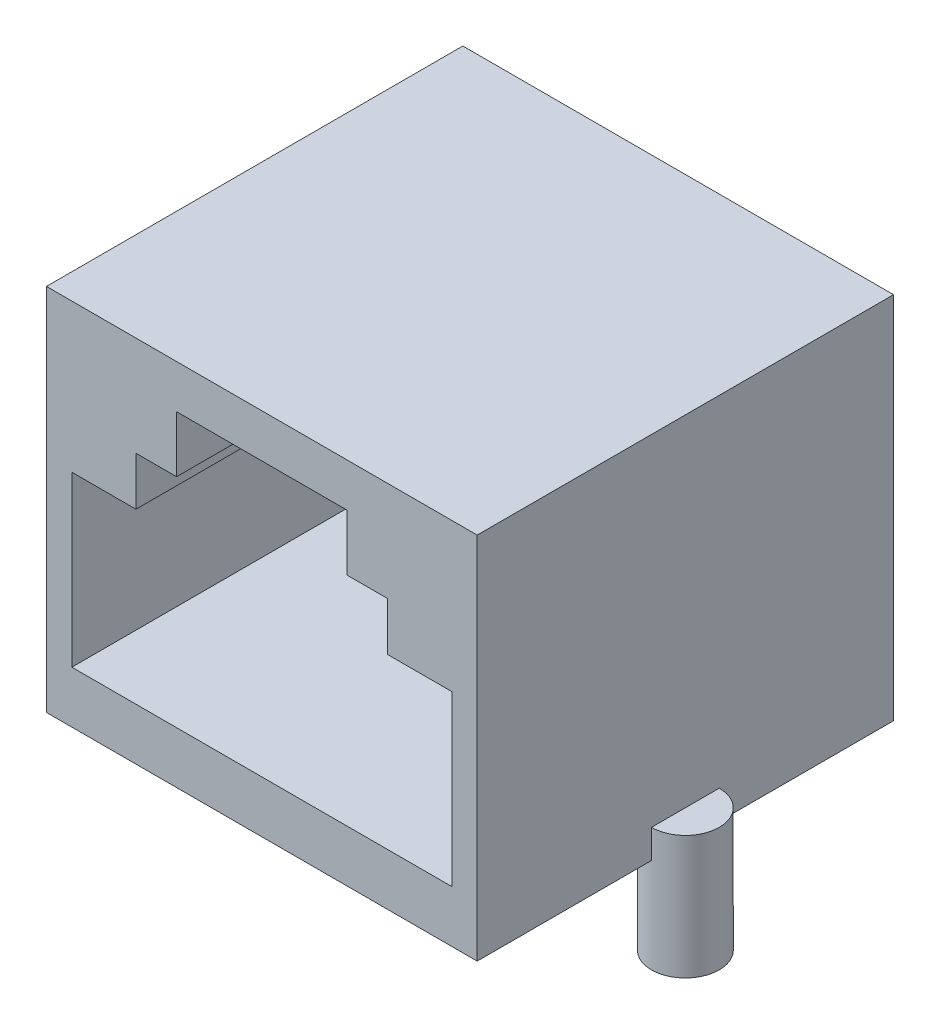
ISO-10303-21;
HEADER;
FILE_DESCRIPTION(('STEP AP214'),'2;1');
FILE_NAME('part.step','',(''),(''),'','','');
FILE_SCHEMA(('AUTOMOTIVE_DESIGN { 1 0 10303 214 1 1 1 1 }'));
ENDSEC;
DATA;
#1=APPLICATION_CONTEXT('core data for automotive mechanical design processes');
#2=APPLICATION_PROTOCOL_DEFINITION('international standard','automotive_design',2000,#1);
#3=PRODUCT_CONTEXT('',#1,'mechanical');
#4=PRODUCT('Part','Part','',(#3));
#5=PRODUCT_RELATED_PRODUCT_CATEGORY('part','',(#4));
#6=PRODUCT_DEFINITION_FORMATION('','',#4);
#7=PRODUCT_DEFINITION_CONTEXT('part definition',#1,'design');
#8=PRODUCT_DEFINITION('design','',#6,#7);
#9=PRODUCT_DEFINITION_SHAPE('','',#8);
#10=(LENGTH_UNIT() NAMED_UNIT(*) SI_UNIT(.MILLI.,.METRE.));
#11=(NAMED_UNIT(*) PLANE_ANGLE_UNIT() SI_UNIT($,.RADIAN.));
#12=(NAMED_UNIT(*) SI_UNIT($,.STERADIAN.) SOLID_ANGLE_UNIT());
#13=UNCERTAINTY_MEASURE_WITH_UNIT(LENGTH_MEASURE(1.E-05),#10,'distance_accuracy_value','');
#14=(GEOMETRIC_REPRESENTATION_CONTEXT(3) GLOBAL_UNCERTAINTY_ASSIGNED_CONTEXT((#13)) GLOBAL_UNIT_ASSIGNED_CONTEXT((#10,
#11,#12)) REPRESENTATION_CONTEXT('',''));
#15=CARTESIAN_POINT('',(0.,0.,0.));
#16=DIRECTION('',(0.,0.,1.));
#17=DIRECTION('',(1.,0.,0.));
#18=AXIS2_PLACEMENT_3D('',#15,#16,#17);
#19=CARTESIAN_POINT('',(-7.5,12.85,-7.25));
#20=DIRECTION('',(1.,0.,0.));
#21=DIRECTION('',(0.,0.,-1.));
#22=AXIS2_PLACEMENT_3D('',#19,#20,#21);
#23=PLANE('',#22);
#24=DIRECTION('',(0.,0.,-1.));
#25=VECTOR('',#24,1.);
#26=CARTESIAN_POINT('',(-7.5,1.,-7.25));
#27=LINE('',#26,#25);
#28=CARTESIAN_POINT('',(-7.5,1.,1.18));
#29=VERTEX_POINT('',#28);
#30=CARTESIAN_POINT('',(-7.5,1.,-1.18));
#31=VERTEX_POINT('',#30);
#32=EDGE_CURVE('E331',#29,#31,#27,.T.);
#33=ORIENTED_EDGE('',*,*,#32,.F.);
#34=DIRECTION('',(0.,-1.,0.));
#35=VECTOR('',#34,1.);
#36=CARTESIAN_POINT('',(-7.5,1.,1.18));
#37=LINE('',#36,#35);
#38=CARTESIAN_POINT('',(-7.5,0.,1.18));
#39=VERTEX_POINT('',#38);
#40=EDGE_CURVE('E292',#29,#39,#37,.T.);
#41=ORIENTED_EDGE('',*,*,#40,.T.);
#42=DIRECTION('',(0.,0.,1.));
#43=VECTOR('',#42,1.);
#44=CARTESIAN_POINT('',(-7.5,0.,-7.25));
#45=LINE('',#44,#43);
#46=CARTESIAN_POINT('',(-7.5,0.,7.25));
#47=VERTEX_POINT('',#46);
#48=EDGE_CURVE('E295',#39,#47,#45,.T.);
#49=ORIENTED_EDGE('',*,*,#48,.T.);
#50=DIRECTION('',(0.,-1.,0.));
#51=VECTOR('',#50,1.);
#52=CARTESIAN_POINT('',(-7.5,12.85,7.25));
#53=LINE('',#52,#51);
#54=CARTESIAN_POINT('',(-7.5,12.85,7.25));
#55=VERTEX_POINT('',#54);
#56=EDGE_CURVE('E325',#55,#47,#53,.T.);
#57=ORIENTED_EDGE('',*,*,#56,.F.);
#58=DIRECTION('',(0.,0.,1.));
#59=VECTOR('',#58,1.);
#60=CARTESIAN_POINT('',(-7.5,12.85,-7.25));
#61=LINE('',#60,#59);
#62=CARTESIAN_POINT('',(-7.5,12.85,-7.25));
#63=VERTEX_POINT('',#62);
#64=EDGE_CURVE('E296',#63,#55,#61,.T.);
#65=ORIENTED_EDGE('',*,*,#64,.F.);
#66=DIRECTION('',(0.,-1.,0.));
#67=VECTOR('',#66,1.);
#68=CARTESIAN_POINT('',(-7.5,12.85,-7.25));
#69=LINE('',#68,#67);
#70=CARTESIAN_POINT('',(-7.5,0.,-7.25));
#71=VERTEX_POINT('',#70);
#72=EDGE_CURVE('E306',#63,#71,#69,.T.);
#73=ORIENTED_EDGE('',*,*,#72,.T.);
#74=CARTESIAN_POINT('',(-7.5,0.,-1.18));
#75=VERTEX_POINT('',#74);
#76=EDGE_CURVE('E307',#71,#75,#45,.T.);
#77=ORIENTED_EDGE('',*,*,#76,.T.);
#78=DIRECTION('',(0.,-1.,0.));
#79=VECTOR('',#78,1.);
#80=CARTESIAN_POINT('',(-7.5,1.,-1.18));
#81=LINE('',#80,#79);
#82=EDGE_CURVE('E289',#75,#31,#81,.F.);
#83=ORIENTED_EDGE('',*,*,#82,.T.);
#84=EDGE_LOOP('',(#33,#41,#49,#57,#65,#73,#77,#83));
#85=FACE_BOUND('',#84,.T.);
#86=ADVANCED_FACE('F35',(#85),#23,.F.);
#87=CARTESIAN_POINT('',(-7.5,12.85,7.25));
#88=DIRECTION('',(0.,0.,-1.));
#89=DIRECTION('',(-1.,0.,0.));
#90=AXIS2_PLACEMENT_3D('',#87,#88,#89);
#91=PLANE('',#90);
#92=DIRECTION('',(-1.,0.,0.));
#93=VECTOR('',#92,1.);
#94=CARTESIAN_POINT('',(-2.96760829263069,9.37615414178526,7.25));
#95=LINE('',#94,#93);
#96=CARTESIAN_POINT('',(-2.96760829263069,9.37615414178526,7.25));
#97=VERTEX_POINT('',#96);
#98=CARTESIAN_POINT('',(-4.3833480285646,9.37615414178526,7.25));
#99=VERTEX_POINT('',#98);
#100=EDGE_CURVE('E225',#97,#99,#95,.T.);
#101=ORIENTED_EDGE('',*,*,#100,.F.);
#102=DIRECTION('',(0.,-1.,0.));
#103=VECTOR('',#102,1.);
#104=CARTESIAN_POINT('',(-2.96760829263069,11.3364091607707,7.25));
#105=LINE('',#104,#103);
#106=CARTESIAN_POINT('',(-2.96760829263069,11.3364091607707,7.25));
#107=VERTEX_POINT('',#106);
#108=EDGE_CURVE('E49',#107,#97,#105,.T.);
#109=ORIENTED_EDGE('',*,*,#108,.F.);
#110=DIRECTION('',(-1.,0.,0.));
#111=VECTOR('',#110,1.);
#112=CARTESIAN_POINT('',(2.96760829263069,11.3364091607706,7.25));
#113=LINE('',#112,#111);
#114=CARTESIAN_POINT('',(2.96760829263069,11.3364091607706,7.25));
#115=VERTEX_POINT('',#114);
#116=EDGE_CURVE('E193',#115,#107,#113,.T.);
#117=ORIENTED_EDGE('',*,*,#116,.F.);
#118=DIRECTION('',(0.,1.,0.));
#119=VECTOR('',#118,1.);
#120=CARTESIAN_POINT('',(2.96760829263069,11.3364091607706,7.25));
#121=LINE('',#120,#119);
#122=CARTESIAN_POINT('',(2.96760829263069,9.37615414178525,7.25));
#123=VERTEX_POINT('',#122);
#124=EDGE_CURVE('E196',#123,#115,#121,.T.);
#125=ORIENTED_EDGE('',*,*,#124,.F.);
#126=DIRECTION('',(-1.,0.,0.));
#127=VECTOR('',#126,1.);
#128=CARTESIAN_POINT('',(2.96760829263069,9.37615414178525,7.25));
#129=LINE('',#128,#127);
#130=CARTESIAN_POINT('',(4.3833480285646,9.37615414178525,7.25));
#131=VERTEX_POINT('',#130);
#132=EDGE_CURVE('E248',#131,#123,#129,.T.);
#133=ORIENTED_EDGE('',*,*,#132,.F.);
#134=DIRECTION('',(0.,1.,0.));
#135=VECTOR('',#134,1.);
#136=CARTESIAN_POINT('',(4.3833480285646,9.37615414178525,7.25));
#137=LINE('',#136,#135);
#138=CARTESIAN_POINT('',(4.3833480285646,7.68815676432559,7.25));
#139=VERTEX_POINT('',#138);
#140=EDGE_CURVE('E245',#139,#131,#137,.T.);
#141=ORIENTED_EDGE('',*,*,#140,.F.);
#142=DIRECTION('',(-1.,0.,0.));
#143=VECTOR('',#142,1.);
#144=CARTESIAN_POINT('',(4.3833480285646,7.68815676432559,7.25));
#145=LINE('',#144,#143);
#146=CARTESIAN_POINT('',(6.61586068907577,7.68815676432559,7.25));
#147=VERTEX_POINT('',#146);
#148=EDGE_CURVE('E242',#147,#139,#145,.T.);
#149=ORIENTED_EDGE('',*,*,#148,.F.);
#150=DIRECTION('',(0.,1.,0.));
#151=VECTOR('',#150,1.);
#152=CARTESIAN_POINT('',(6.61586068907577,7.68815676432559,7.25));
#153=LINE('',#152,#151);
#154=CARTESIAN_POINT('',(6.61586068907577,1.80739170736935,7.25));
#155=VERTEX_POINT('',#154);
#156=EDGE_CURVE('E239',#155,#147,#153,.T.);
#157=ORIENTED_EDGE('',*,*,#156,.F.);
#158=DIRECTION('',(1.,0.,0.));
#159=VECTOR('',#158,1.);
#160=CARTESIAN_POINT('',(-6.61586068907577,1.80739170736935,7.25));
#161=LINE('',#160,#159);
#162=CARTESIAN_POINT('',(-6.61586068907577,1.80739170736935,7.25));
#163=VERTEX_POINT('',#162);
#164=EDGE_CURVE('E236',#163,#155,#161,.T.);
#165=ORIENTED_EDGE('',*,*,#164,.F.);
#166=DIRECTION('',(0.,-1.,0.));
#167=VECTOR('',#166,1.);
#168=CARTESIAN_POINT('',(-6.61586068907577,7.68815676432559,7.25));
#169=LINE('',#168,#167);
#170=CARTESIAN_POINT('',(-6.61586068907577,7.68815676432559,7.25));
#171=VERTEX_POINT('',#170);
#172=EDGE_CURVE('E233',#171,#163,#169,.T.);
#173=ORIENTED_EDGE('',*,*,#172,.F.);
#174=DIRECTION('',(-1.,0.,0.));
#175=VECTOR('',#174,1.);
#176=CARTESIAN_POINT('',(-4.3833480285646,7.68815676432559,7.25));
#177=LINE('',#176,#175);
#178=CARTESIAN_POINT('',(-4.3833480285646,7.68815676432559,7.25));
#179=VERTEX_POINT('',#178);
#180=EDGE_CURVE('E230',#179,#171,#177,.T.);
#181=ORIENTED_EDGE('',*,*,#180,.F.);
#182=DIRECTION('',(0.,-1.,0.));
#183=VECTOR('',#182,1.);
#184=CARTESIAN_POINT('',(-4.3833480285646,9.37615414178526,7.25));
#185=LINE('',#184,#183);
#186=EDGE_CURVE('E227',#99,#179,#185,.T.);
#187=ORIENTED_EDGE('',*,*,#186,.F.);
#188=EDGE_LOOP('',(#101,#109,#117,#125,#133,#141,#149,#157,#165,#173,#181,#187));
#189=FACE_BOUND('',#188,.T.);
#190=DIRECTION('',(1.,0.,0.));
#191=VECTOR('',#190,1.);
#192=CARTESIAN_POINT('',(-7.5,0.,7.25));
#193=LINE('',#192,#191);
#194=CARTESIAN_POINT('',(7.50000000000001,0.,7.25));
#195=VERTEX_POINT('',#194);
#196=EDGE_CURVE('E310',#47,#195,#193,.T.);
#197=ORIENTED_EDGE('',*,*,#196,.T.);
#198=DIRECTION('',(0.,-1.,0.));
#199=VECTOR('',#198,1.);
#200=CARTESIAN_POINT('',(7.50000000000001,12.85,7.25));
#201=LINE('',#200,#199);
#202=CARTESIAN_POINT('',(7.50000000000001,12.85,7.25));
#203=VERTEX_POINT('',#202);
#204=EDGE_CURVE('E322',#203,#195,#201,.T.);
#205=ORIENTED_EDGE('',*,*,#204,.F.);
#206=DIRECTION('',(1.,0.,0.));
#207=VECTOR('',#206,1.);
#208=CARTESIAN_POINT('',(-7.5,12.85,7.25));
#209=LINE('',#208,#207);
#210=EDGE_CURVE('E299',#55,#203,#209,.T.);
#211=ORIENTED_EDGE('',*,*,#210,.F.);
#212=ORIENTED_EDGE('',*,*,#56,.T.);
#213=EDGE_LOOP('',(#197,#205,#211,#212));
#214=FACE_BOUND('',#213,.T.);
#215=ADVANCED_FACE('F344',(#189,#214),#91,.F.);
#216=CARTESIAN_POINT('',(7.5,12.85,-7.25));
#217=DIRECTION('',(-1.,0.,0.));
#218=DIRECTION('',(0.,0.,1.));
#219=AXIS2_PLACEMENT_3D('',#216,#217,#218);
#220=PLANE('',#219);
#221=DIRECTION('',(0.,0.,-1.));
#222=VECTOR('',#221,1.);
#223=CARTESIAN_POINT('',(7.5,1.,-7.25));
#224=LINE('',#223,#222);
#225=CARTESIAN_POINT('',(7.5,1.,1.18));
#226=VERTEX_POINT('',#225);
#227=CARTESIAN_POINT('',(7.5,1.,-1.18));
#228=VERTEX_POINT('',#227);
#229=EDGE_CURVE('E11',#226,#228,#224,.T.);
#230=ORIENTED_EDGE('',*,*,#229,.T.);
#231=DIRECTION('',(0.,-1.,0.));
#232=VECTOR('',#231,1.);
#233=CARTESIAN_POINT('',(7.5,1.,-1.18));
#234=LINE('',#233,#232);
#235=CARTESIAN_POINT('',(7.5,0.,-1.18));
#236=VERTEX_POINT('',#235);
#237=EDGE_CURVE('E280',#228,#236,#234,.T.);
#238=ORIENTED_EDGE('',*,*,#237,.T.);
#239=DIRECTION('',(0.,0.,-1.));
#240=VECTOR('',#239,1.);
#241=CARTESIAN_POINT('',(7.5,0.,-7.25));
#242=LINE('',#241,#240);
#243=CARTESIAN_POINT('',(7.5,0.,-7.25));
#244=VERTEX_POINT('',#243);
#245=EDGE_CURVE('E312',#236,#244,#242,.T.);
#246=ORIENTED_EDGE('',*,*,#245,.T.);
#247=DIRECTION('',(0.,-1.,0.));
#248=VECTOR('',#247,1.);
#249=CARTESIAN_POINT('',(7.5,12.85,-7.25));
#250=LINE('',#249,#248);
#251=CARTESIAN_POINT('',(7.5,12.85,-7.25));
#252=VERTEX_POINT('',#251);
#253=EDGE_CURVE('E319',#252,#244,#250,.T.);
#254=ORIENTED_EDGE('',*,*,#253,.F.);
#255=DIRECTION('',(0.,0.,-1.));
#256=VECTOR('',#255,1.);
#257=CARTESIAN_POINT('',(7.5,12.85,-7.25));
#258=LINE('',#257,#256);
#259=EDGE_CURVE('E302',#203,#252,#258,.T.);
#260=ORIENTED_EDGE('',*,*,#259,.F.);
#261=ORIENTED_EDGE('',*,*,#204,.T.);
#262=CARTESIAN_POINT('',(7.5,0.,1.18));
#263=VERTEX_POINT('',#262);
#264=EDGE_CURVE('E313',#195,#263,#242,.T.);
#265=ORIENTED_EDGE('',*,*,#264,.T.);
#266=DIRECTION('',(0.,-1.,0.));
#267=VECTOR('',#266,1.);
#268=CARTESIAN_POINT('',(7.5,1.,1.18));
#269=LINE('',#268,#267);
#270=EDGE_CURVE('E57',#263,#226,#269,.F.);
#271=ORIENTED_EDGE('',*,*,#270,.T.);
#272=EDGE_LOOP('',(#230,#238,#246,#254,#260,#261,#265,#271));
#273=FACE_BOUND('',#272,.T.);
#274=ADVANCED_FACE('F339',(#273),#220,.F.);
#275=CARTESIAN_POINT('',(-7.5,12.85,-7.25));
#276=DIRECTION('',(0.,0.,1.));
#277=DIRECTION('',(1.,0.,0.));
#278=AXIS2_PLACEMENT_3D('',#275,#276,#277);
#279=PLANE('',#278);
#280=DIRECTION('',(-1.,0.,0.));
#281=VECTOR('',#280,1.);
#282=CARTESIAN_POINT('',(-7.5,0.,-7.25));
#283=LINE('',#282,#281);
#284=EDGE_CURVE('E300',#244,#71,#283,.T.);
#285=ORIENTED_EDGE('',*,*,#284,.T.);
#286=ORIENTED_EDGE('',*,*,#72,.F.);
#287=DIRECTION('',(-1.,0.,0.));
#288=VECTOR('',#287,1.);
#289=CARTESIAN_POINT('',(-7.5,12.85,-7.25));
#290=LINE('',#289,#288);
#291=EDGE_CURVE('E304',#252,#63,#290,.T.);
#292=ORIENTED_EDGE('',*,*,#291,.F.);
#293=ORIENTED_EDGE('',*,*,#253,.T.);
#294=EDGE_LOOP('',(#285,#286,#292,#293));
#295=FACE_BOUND('',#294,.T.);
#296=ADVANCED_FACE('F380',(#295),#279,.F.);
#297=CARTESIAN_POINT('',(0.,12.85,0.));
#298=DIRECTION('',(0.,1.,0.));
#299=DIRECTION('',(0.,0.,1.));
#300=AXIS2_PLACEMENT_3D('',#297,#298,#299);
#301=PLANE('',#300);
#302=ORIENTED_EDGE('',*,*,#64,.T.);
#303=ORIENTED_EDGE('',*,*,#210,.T.);
#304=ORIENTED_EDGE('',*,*,#259,.T.);
#305=ORIENTED_EDGE('',*,*,#291,.T.);
#306=EDGE_LOOP('',(#302,#303,#304,#305));
#307=FACE_BOUND('',#306,.T.);
#308=ADVANCED_FACE('F366',(#307),#301,.T.);
#309=CARTESIAN_POINT('',(0.,0.,0.));
#310=DIRECTION('',(0.,1.,0.));
#311=DIRECTION('',(0.,0.,1.));
#312=AXIS2_PLACEMENT_3D('',#309,#310,#311);
#313=PLANE('',#312);
#314=ORIENTED_EDGE('',*,*,#245,.F.);
#315=CARTESIAN_POINT('',(7.5,0.,0.));
#316=DIRECTION('',(0.,1.,0.));
#317=DIRECTION('',(0.,0.,1.));
#318=AXIS2_PLACEMENT_3D('',#315,#316,#317);
#319=CIRCLE('',#318,1.18);
#320=EDGE_CURVE('E42',#236,#263,#319,.T.);
#321=ORIENTED_EDGE('',*,*,#320,.T.);
#322=ORIENTED_EDGE('',*,*,#264,.F.);
#323=ORIENTED_EDGE('',*,*,#196,.F.);
#324=ORIENTED_EDGE('',*,*,#48,.F.);
#325=CARTESIAN_POINT('',(-7.5,0.,0.));
#326=DIRECTION('',(0.,1.,0.));
#327=DIRECTION('',(0.,0.,1.));
#328=AXIS2_PLACEMENT_3D('',#325,#326,#327);
#329=CIRCLE('',#328,1.18);
#330=EDGE_CURVE('E328',#39,#75,#329,.T.);
#331=ORIENTED_EDGE('',*,*,#330,.T.);
#332=ORIENTED_EDGE('',*,*,#76,.F.);
#333=ORIENTED_EDGE('',*,*,#284,.F.);
#334=EDGE_LOOP('',(#314,#321,#322,#323,#324,#331,#332,#333));
#335=FACE_BOUND('',#334,.T.);
#336=ADVANCED_FACE('F335',(#335),#313,.F.);
#337=CARTESIAN_POINT('',(-7.5,1.,0.));
#338=DIRECTION('',(0.,-1.,0.));
#339=DIRECTION('',(0.,0.,-1.));
#340=AXIS2_PLACEMENT_3D('',#337,#338,#339);
#341=PLANE('',#340);
#342=CARTESIAN_POINT('',(-7.5,1.,0.));
#343=DIRECTION('',(0.,-1.,0.));
#344=DIRECTION('',(0.,0.,-1.));
#345=AXIS2_PLACEMENT_3D('',#342,#343,#344);
#346=CIRCLE('',#345,1.18);
#347=EDGE_CURVE('E286',#29,#31,#346,.T.);
#348=ORIENTED_EDGE('',*,*,#347,.F.);
#349=ORIENTED_EDGE('',*,*,#32,.T.);
#350=EDGE_LOOP('',(#348,#349));
#351=FACE_BOUND('',#350,.T.);
#352=ADVANCED_FACE('F355',(#351),#341,.F.);
#353=CARTESIAN_POINT('',(-7.5,1.,0.));
#354=DIRECTION('',(0.,-1.,0.));
#355=DIRECTION('',(0.,0.,-1.));
#356=AXIS2_PLACEMENT_3D('',#353,#354,#355);
#357=CYLINDRICAL_SURFACE('',#356,1.18);
#358=CARTESIAN_POINT('',(-7.5,-3.3,0.));
#359=DIRECTION('',(0.,-1.,0.));
#360=DIRECTION('',(0.,0.,-1.));
#361=AXIS2_PLACEMENT_3D('',#358,#359,#360);
#362=CIRCLE('',#361,1.18);
#363=CARTESIAN_POINT('',(-7.5,-3.3,-1.18));
#364=VERTEX_POINT('',#363);
#365=EDGE_CURVE('E283',#364,#364,#362,.T.);
#366=ORIENTED_EDGE('',*,*,#365,.F.);
#367=EDGE_LOOP('',(#366));
#368=FACE_BOUND('',#367,.T.);
#369=ORIENTED_EDGE('',*,*,#40,.F.);
#370=ORIENTED_EDGE('',*,*,#347,.T.);
#371=ORIENTED_EDGE('',*,*,#82,.F.);
#372=ORIENTED_EDGE('',*,*,#330,.F.);
#373=EDGE_LOOP('',(#369,#370,#371,#372));
#374=FACE_BOUND('',#373,.T.);
#375=ADVANCED_FACE('F353',(#368,#374),#357,.T.);
#376=CARTESIAN_POINT('',(-7.5,-3.3,0.));
#377=DIRECTION('',(0.,-1.,0.));
#378=DIRECTION('',(0.,0.,-1.));
#379=AXIS2_PLACEMENT_3D('',#376,#377,#378);
#380=PLANE('',#379);
#381=ORIENTED_EDGE('',*,*,#365,.T.);
#382=EDGE_LOOP('',(#381));
#383=FACE_BOUND('',#382,.T.);
#384=ADVANCED_FACE('F362',(#383),#380,.T.);
#385=CARTESIAN_POINT('',(7.5,1.,0.));
#386=DIRECTION('',(0.,1.,0.));
#387=DIRECTION('',(0.,0.,1.));
#388=AXIS2_PLACEMENT_3D('',#385,#386,#387);
#389=PLANE('',#388);
#390=ORIENTED_EDGE('',*,*,#229,.F.);
#391=CARTESIAN_POINT('',(7.5,1.,0.));
#392=DIRECTION('',(0.,-1.,0.));
#393=DIRECTION('',(0.,0.,1.));
#394=AXIS2_PLACEMENT_3D('',#391,#392,#393);
#395=CIRCLE('',#394,1.18);
#396=EDGE_CURVE('E277',#228,#226,#395,.T.);
#397=ORIENTED_EDGE('',*,*,#396,.F.);
#398=EDGE_LOOP('',(#390,#397));
#399=FACE_BOUND('',#398,.T.);
#400=ADVANCED_FACE('F394',(#399),#389,.T.);
#401=CARTESIAN_POINT('',(7.5,1.,0.));
#402=DIRECTION('',(0.,-1.,0.));
#403=DIRECTION('',(0.,0.,-1.));
#404=AXIS2_PLACEMENT_3D('',#401,#402,#403);
#405=CYLINDRICAL_SURFACE('',#404,1.18);
#406=CARTESIAN_POINT('',(7.5,-3.3,0.));
#407=DIRECTION('',(0.,-1.,0.));
#408=DIRECTION('',(0.,0.,1.));
#409=AXIS2_PLACEMENT_3D('',#406,#407,#408);
#410=CIRCLE('',#409,1.18);
#411=CARTESIAN_POINT('',(7.5,-3.3,1.18));
#412=VERTEX_POINT('',#411);
#413=EDGE_CURVE('E255',#412,#412,#410,.T.);
#414=ORIENTED_EDGE('',*,*,#413,.F.);
#415=EDGE_LOOP('',(#414));
#416=FACE_BOUND('',#415,.T.);
#417=ORIENTED_EDGE('',*,*,#237,.F.);
#418=ORIENTED_EDGE('',*,*,#396,.T.);
#419=ORIENTED_EDGE('',*,*,#270,.F.);
#420=ORIENTED_EDGE('',*,*,#320,.F.);
#421=EDGE_LOOP('',(#417,#418,#419,#420));
#422=FACE_BOUND('',#421,.T.);
#423=ADVANCED_FACE('F392',(#416,#422),#405,.T.);
#424=CARTESIAN_POINT('',(7.5,-3.3,0.));
#425=DIRECTION('',(0.,1.,0.));
#426=DIRECTION('',(0.,0.,1.));
#427=AXIS2_PLACEMENT_3D('',#424,#425,#426);
#428=PLANE('',#427);
#429=ORIENTED_EDGE('',*,*,#413,.T.);
#430=EDGE_LOOP('',(#429));
#431=FACE_BOUND('',#430,.T.);
#432=ADVANCED_FACE('F401',(#431),#428,.F.);
#433=CARTESIAN_POINT('',(-2.96760829263069,11.3364091607707,-2.75));
#434=DIRECTION('',(-1.,0.,0.));
#435=DIRECTION('',(0.,0.,1.));
#436=AXIS2_PLACEMENT_3D('',#433,#434,#435);
#437=PLANE('',#436);
#438=ORIENTED_EDGE('',*,*,#108,.T.);
#439=DIRECTION('',(0.,0.,1.));
#440=VECTOR('',#439,1.);
#441=CARTESIAN_POINT('',(-2.96760829263069,9.37615414178526,-2.75));
#442=LINE('',#441,#440);
#443=CARTESIAN_POINT('',(-2.96760829263069,9.37615414178526,-2.75));
#444=VERTEX_POINT('',#443);
#445=EDGE_CURVE('E170',#444,#97,#442,.T.);
#446=ORIENTED_EDGE('',*,*,#445,.F.);
#447=DIRECTION('',(0.,-1.,0.));
#448=VECTOR('',#447,1.);
#449=CARTESIAN_POINT('',(-2.96760829263069,11.3364091607707,-2.75));
#450=LINE('',#449,#448);
#451=CARTESIAN_POINT('',(-2.96760829263069,11.3364091607707,-2.75));
#452=VERTEX_POINT('',#451);
#453=EDGE_CURVE('E174',#452,#444,#450,.T.);
#454=ORIENTED_EDGE('',*,*,#453,.F.);
#455=DIRECTION('',(0.,0.,1.));
#456=VECTOR('',#455,1.);
#457=CARTESIAN_POINT('',(-2.96760829263069,11.3364091607707,-2.75));
#458=LINE('',#457,#456);
#459=EDGE_CURVE('E253',#452,#107,#458,.T.);
#460=ORIENTED_EDGE('',*,*,#459,.T.);
#461=EDGE_LOOP('',(#438,#446,#454,#460));
#462=FACE_BOUND('',#461,.T.);
#463=ADVANCED_FACE('F172',(#462),#437,.F.);
#464=CARTESIAN_POINT('',(2.96760829263069,11.3364091607706,-2.75));
#465=DIRECTION('',(0.,1.,0.));
#466=DIRECTION('',(-1.,0.,0.));
#467=AXIS2_PLACEMENT_3D('',#464,#465,#466);
#468=PLANE('',#467);
#469=ORIENTED_EDGE('',*,*,#116,.T.);
#470=ORIENTED_EDGE('',*,*,#459,.F.);
#471=DIRECTION('',(-1.,0.,0.));
#472=VECTOR('',#471,1.);
#473=CARTESIAN_POINT('',(2.96760829263069,11.3364091607706,-2.75));
#474=LINE('',#473,#472);
#475=CARTESIAN_POINT('',(2.96760829263069,11.3364091607706,-2.75));
#476=VERTEX_POINT('',#475);
#477=EDGE_CURVE('E180',#476,#452,#474,.T.);
#478=ORIENTED_EDGE('',*,*,#477,.F.);
#479=DIRECTION('',(0.,0.,1.));
#480=VECTOR('',#479,1.);
#481=CARTESIAN_POINT('',(2.96760829263069,11.3364091607706,-2.75));
#482=LINE('',#481,#480);
#483=EDGE_CURVE('E256',#476,#115,#482,.T.);
#484=ORIENTED_EDGE('',*,*,#483,.T.);
#485=EDGE_LOOP('',(#469,#470,#478,#484));
#486=FACE_BOUND('',#485,.T.);
#487=ADVANCED_FACE('F411',(#486),#468,.F.);
#488=CARTESIAN_POINT('',(2.96760829263069,11.3364091607706,-2.75));
#489=DIRECTION('',(1.,0.,0.));
#490=DIRECTION('',(0.,0.,-1.));
#491=AXIS2_PLACEMENT_3D('',#488,#489,#490);
#492=PLANE('',#491);
#493=ORIENTED_EDGE('',*,*,#124,.T.);
#494=ORIENTED_EDGE('',*,*,#483,.F.);
#495=DIRECTION('',(0.,1.,0.));
#496=VECTOR('',#495,1.);
#497=CARTESIAN_POINT('',(2.96760829263069,11.3364091607706,-2.75));
#498=LINE('',#497,#496);
#499=CARTESIAN_POINT('',(2.96760829263069,9.37615414178525,-2.75));
#500=VERTEX_POINT('',#499);
#501=EDGE_CURVE('E221',#500,#476,#498,.T.);
#502=ORIENTED_EDGE('',*,*,#501,.F.);
#503=DIRECTION('',(0.,0.,1.));
#504=VECTOR('',#503,1.);
#505=CARTESIAN_POINT('',(2.96760829263069,9.37615414178525,-2.75));
#506=LINE('',#505,#504);
#507=EDGE_CURVE('E258',#500,#123,#506,.T.);
#508=ORIENTED_EDGE('',*,*,#507,.T.);
#509=EDGE_LOOP('',(#493,#494,#502,#508));
#510=FACE_BOUND('',#509,.T.);
#511=ADVANCED_FACE('F445',(#510),#492,.F.);
#512=CARTESIAN_POINT('',(2.96760829263069,9.37615414178525,-2.75));
#513=DIRECTION('',(0.,1.,0.));
#514=DIRECTION('',(0.,0.,1.));
#515=AXIS2_PLACEMENT_3D('',#512,#513,#514);
#516=PLANE('',#515);
#517=ORIENTED_EDGE('',*,*,#132,.T.);
#518=ORIENTED_EDGE('',*,*,#507,.F.);
#519=DIRECTION('',(-1.,0.,0.));
#520=VECTOR('',#519,1.);
#521=CARTESIAN_POINT('',(2.96760829263069,9.37615414178525,-2.75));
#522=LINE('',#521,#520);
#523=CARTESIAN_POINT('',(4.3833480285646,9.37615414178525,-2.75));
#524=VERTEX_POINT('',#523);
#525=EDGE_CURVE('E218',#524,#500,#522,.T.);
#526=ORIENTED_EDGE('',*,*,#525,.F.);
#527=DIRECTION('',(0.,0.,1.));
#528=VECTOR('',#527,1.);
#529=CARTESIAN_POINT('',(4.3833480285646,9.37615414178525,-2.75));
#530=LINE('',#529,#528);
#531=EDGE_CURVE('E260',#524,#131,#530,.T.);
#532=ORIENTED_EDGE('',*,*,#531,.T.);
#533=EDGE_LOOP('',(#517,#518,#526,#532));
#534=FACE_BOUND('',#533,.T.);
#535=ADVANCED_FACE('F441',(#534),#516,.F.);
#536=CARTESIAN_POINT('',(4.3833480285646,9.37615414178525,-2.75));
#537=DIRECTION('',(1.,0.,0.));
#538=DIRECTION('',(0.,0.,-1.));
#539=AXIS2_PLACEMENT_3D('',#536,#537,#538);
#540=PLANE('',#539);
#541=ORIENTED_EDGE('',*,*,#140,.T.);
#542=ORIENTED_EDGE('',*,*,#531,.F.);
#543=DIRECTION('',(0.,1.,0.));
#544=VECTOR('',#543,1.);
#545=CARTESIAN_POINT('',(4.3833480285646,9.37615414178525,-2.75));
#546=LINE('',#545,#544);
#547=CARTESIAN_POINT('',(4.3833480285646,7.68815676432559,-2.75));
#548=VERTEX_POINT('',#547);
#549=EDGE_CURVE('E215',#548,#524,#546,.T.);
#550=ORIENTED_EDGE('',*,*,#549,.F.);
#551=DIRECTION('',(0.,0.,1.));
#552=VECTOR('',#551,1.);
#553=CARTESIAN_POINT('',(4.3833480285646,7.68815676432559,-2.75));
#554=LINE('',#553,#552);
#555=EDGE_CURVE('E262',#548,#139,#554,.T.);
#556=ORIENTED_EDGE('',*,*,#555,.T.);
#557=EDGE_LOOP('',(#541,#542,#550,#556));
#558=FACE_BOUND('',#557,.T.);
#559=ADVANCED_FACE('F437',(#558),#540,.F.);
#560=CARTESIAN_POINT('',(4.3833480285646,7.68815676432559,-2.75));
#561=DIRECTION('',(0.,1.,0.));
#562=DIRECTION('',(0.,0.,1.));
#563=AXIS2_PLACEMENT_3D('',#560,#561,#562);
#564=PLANE('',#563);
#565=ORIENTED_EDGE('',*,*,#148,.T.);
#566=ORIENTED_EDGE('',*,*,#555,.F.);
#567=DIRECTION('',(-1.,0.,0.));
#568=VECTOR('',#567,1.);
#569=CARTESIAN_POINT('',(4.3833480285646,7.68815676432559,-2.75));
#570=LINE('',#569,#568);
#571=CARTESIAN_POINT('',(6.61586068907577,7.68815676432559,-2.75));
#572=VERTEX_POINT('',#571);
#573=EDGE_CURVE('E212',#572,#548,#570,.T.);
#574=ORIENTED_EDGE('',*,*,#573,.F.);
#575=DIRECTION('',(0.,0.,1.));
#576=VECTOR('',#575,1.);
#577=CARTESIAN_POINT('',(6.61586068907577,7.68815676432559,-2.75));
#578=LINE('',#577,#576);
#579=EDGE_CURVE('E264',#572,#147,#578,.T.);
#580=ORIENTED_EDGE('',*,*,#579,.T.);
#581=EDGE_LOOP('',(#565,#566,#574,#580));
#582=FACE_BOUND('',#581,.T.);
#583=ADVANCED_FACE('F433',(#582),#564,.F.);
#584=CARTESIAN_POINT('',(6.61586068907577,7.68815676432559,-2.75));
#585=DIRECTION('',(1.,0.,0.));
#586=DIRECTION('',(0.,0.,-1.));
#587=AXIS2_PLACEMENT_3D('',#584,#585,#586);
#588=PLANE('',#587);
#589=ORIENTED_EDGE('',*,*,#156,.T.);
#590=ORIENTED_EDGE('',*,*,#579,.F.);
#591=DIRECTION('',(0.,1.,0.));
#592=VECTOR('',#591,1.);
#593=CARTESIAN_POINT('',(6.61586068907577,7.68815676432559,-2.75));
#594=LINE('',#593,#592);
#595=CARTESIAN_POINT('',(6.61586068907577,1.80739170736935,-2.75));
#596=VERTEX_POINT('',#595);
#597=EDGE_CURVE('E209',#596,#572,#594,.T.);
#598=ORIENTED_EDGE('',*,*,#597,.F.);
#599=DIRECTION('',(0.,0.,1.));
#600=VECTOR('',#599,1.);
#601=CARTESIAN_POINT('',(6.61586068907577,1.80739170736935,-2.75));
#602=LINE('',#601,#600);
#603=EDGE_CURVE('E266',#596,#155,#602,.T.);
#604=ORIENTED_EDGE('',*,*,#603,.T.);
#605=EDGE_LOOP('',(#589,#590,#598,#604));
#606=FACE_BOUND('',#605,.T.);
#607=ADVANCED_FACE('F429',(#606),#588,.F.);
#608=CARTESIAN_POINT('',(-6.61586068907577,1.80739170736935,-2.75));
#609=DIRECTION('',(0.,-1.,0.));
#610=DIRECTION('',(1.,0.,0.));
#611=AXIS2_PLACEMENT_3D('',#608,#609,#610);
#612=PLANE('',#611);
#613=ORIENTED_EDGE('',*,*,#164,.T.);
#614=ORIENTED_EDGE('',*,*,#603,.F.);
#615=DIRECTION('',(1.,0.,0.));
#616=VECTOR('',#615,1.);
#617=CARTESIAN_POINT('',(-6.61586068907577,1.80739170736935,-2.75));
#618=LINE('',#617,#616);
#619=CARTESIAN_POINT('',(-6.61586068907577,1.80739170736935,-2.75));
#620=VERTEX_POINT('',#619);
#621=EDGE_CURVE('E206',#620,#596,#618,.T.);
#622=ORIENTED_EDGE('',*,*,#621,.F.);
#623=DIRECTION('',(0.,0.,1.));
#624=VECTOR('',#623,1.);
#625=CARTESIAN_POINT('',(-6.61586068907577,1.80739170736935,-2.75));
#626=LINE('',#625,#624);
#627=EDGE_CURVE('E268',#620,#163,#626,.T.);
#628=ORIENTED_EDGE('',*,*,#627,.T.);
#629=EDGE_LOOP('',(#613,#614,#622,#628));
#630=FACE_BOUND('',#629,.T.);
#631=ADVANCED_FACE('F425',(#630),#612,.F.);
#632=CARTESIAN_POINT('',(-6.61586068907577,7.68815676432559,-2.75));
#633=DIRECTION('',(-1.,0.,0.));
#634=DIRECTION('',(0.,0.,1.));
#635=AXIS2_PLACEMENT_3D('',#632,#633,#634);
#636=PLANE('',#635);
#637=ORIENTED_EDGE('',*,*,#172,.T.);
#638=ORIENTED_EDGE('',*,*,#627,.F.);
#639=DIRECTION('',(0.,-1.,0.));
#640=VECTOR('',#639,1.);
#641=CARTESIAN_POINT('',(-6.61586068907577,7.68815676432559,-2.75));
#642=LINE('',#641,#640);
#643=CARTESIAN_POINT('',(-6.61586068907577,7.68815676432559,-2.75));
#644=VERTEX_POINT('',#643);
#645=EDGE_CURVE('E203',#644,#620,#642,.T.);
#646=ORIENTED_EDGE('',*,*,#645,.F.);
#647=DIRECTION('',(0.,0.,1.));
#648=VECTOR('',#647,1.);
#649=CARTESIAN_POINT('',(-6.61586068907577,7.68815676432559,-2.75));
#650=LINE('',#649,#648);
#651=EDGE_CURVE('E270',#644,#171,#650,.T.);
#652=ORIENTED_EDGE('',*,*,#651,.T.);
#653=EDGE_LOOP('',(#637,#638,#646,#652));
#654=FACE_BOUND('',#653,.T.);
#655=ADVANCED_FACE('F421',(#654),#636,.F.);
#656=CARTESIAN_POINT('',(-4.3833480285646,7.68815676432559,-2.75));
#657=DIRECTION('',(0.,1.,0.));
#658=DIRECTION('',(0.,0.,1.));
#659=AXIS2_PLACEMENT_3D('',#656,#657,#658);
#660=PLANE('',#659);
#661=ORIENTED_EDGE('',*,*,#180,.T.);
#662=ORIENTED_EDGE('',*,*,#651,.F.);
#663=DIRECTION('',(-1.,0.,0.));
#664=VECTOR('',#663,1.);
#665=CARTESIAN_POINT('',(-4.3833480285646,7.68815676432559,-2.75));
#666=LINE('',#665,#664);
#667=CARTESIAN_POINT('',(-4.3833480285646,7.68815676432559,-2.75));
#668=VERTEX_POINT('',#667);
#669=EDGE_CURVE('E200',#668,#644,#666,.T.);
#670=ORIENTED_EDGE('',*,*,#669,.F.);
#671=DIRECTION('',(0.,0.,1.));
#672=VECTOR('',#671,1.);
#673=CARTESIAN_POINT('',(-4.3833480285646,7.68815676432559,-2.75));
#674=LINE('',#673,#672);
#675=EDGE_CURVE('E272',#668,#179,#674,.T.);
#676=ORIENTED_EDGE('',*,*,#675,.T.);
#677=EDGE_LOOP('',(#661,#662,#670,#676));
#678=FACE_BOUND('',#677,.T.);
#679=ADVANCED_FACE('F417',(#678),#660,.F.);
#680=CARTESIAN_POINT('',(-4.3833480285646,9.37615414178526,-2.75));
#681=DIRECTION('',(-1.,0.,0.));
#682=DIRECTION('',(0.,0.,1.));
#683=AXIS2_PLACEMENT_3D('',#680,#681,#682);
#684=PLANE('',#683);
#685=ORIENTED_EDGE('',*,*,#186,.T.);
#686=ORIENTED_EDGE('',*,*,#675,.F.);
#687=DIRECTION('',(0.,-1.,0.));
#688=VECTOR('',#687,1.);
#689=CARTESIAN_POINT('',(-4.3833480285646,9.37615414178526,-2.75));
#690=LINE('',#689,#688);
#691=CARTESIAN_POINT('',(-4.3833480285646,9.37615414178526,-2.75));
#692=VERTEX_POINT('',#691);
#693=EDGE_CURVE('E188',#692,#668,#690,.T.);
#694=ORIENTED_EDGE('',*,*,#693,.F.);
#695=DIRECTION('',(0.,0.,1.));
#696=VECTOR('',#695,1.);
#697=CARTESIAN_POINT('',(-4.3833480285646,9.37615414178526,-2.75));
#698=LINE('',#697,#696);
#699=EDGE_CURVE('E179',#692,#99,#698,.T.);
#700=ORIENTED_EDGE('',*,*,#699,.T.);
#701=EDGE_LOOP('',(#685,#686,#694,#700));
#702=FACE_BOUND('',#701,.T.);
#703=ADVANCED_FACE('F414',(#702),#684,.F.);
#704=CARTESIAN_POINT('',(-2.96760829263069,9.37615414178526,-2.75));
#705=DIRECTION('',(0.,1.,0.));
#706=DIRECTION('',(0.,0.,1.));
#707=AXIS2_PLACEMENT_3D('',#704,#705,#706);
#708=PLANE('',#707);
#709=ORIENTED_EDGE('',*,*,#100,.T.);
#710=ORIENTED_EDGE('',*,*,#699,.F.);
#711=DIRECTION('',(-1.,0.,0.));
#712=VECTOR('',#711,1.);
#713=CARTESIAN_POINT('',(-2.96760829263069,9.37615414178526,-2.75));
#714=LINE('',#713,#712);
#715=EDGE_CURVE('E183',#444,#692,#714,.T.);
#716=ORIENTED_EDGE('',*,*,#715,.F.);
#717=ORIENTED_EDGE('',*,*,#445,.T.);
#718=EDGE_LOOP('',(#709,#710,#716,#717));
#719=FACE_BOUND('',#718,.T.);
#720=ADVANCED_FACE('F184',(#719),#708,.F.);
#721=CARTESIAN_POINT('',(0.,0.,-2.75));
#722=DIRECTION('',(0.,0.,-1.));
#723=DIRECTION('',(-1.,0.,0.));
#724=AXIS2_PLACEMENT_3D('',#721,#722,#723);
#725=PLANE('',#724);
#726=ORIENTED_EDGE('',*,*,#453,.T.);
#727=ORIENTED_EDGE('',*,*,#715,.T.);
#728=ORIENTED_EDGE('',*,*,#693,.T.);
#729=ORIENTED_EDGE('',*,*,#669,.T.);
#730=ORIENTED_EDGE('',*,*,#645,.T.);
#731=ORIENTED_EDGE('',*,*,#621,.T.);
#732=ORIENTED_EDGE('',*,*,#597,.T.);
#733=ORIENTED_EDGE('',*,*,#573,.T.);
#734=ORIENTED_EDGE('',*,*,#549,.T.);
#735=ORIENTED_EDGE('',*,*,#525,.T.);
#736=ORIENTED_EDGE('',*,*,#501,.T.);
#737=ORIENTED_EDGE('',*,*,#477,.T.);
#738=EDGE_LOOP('',(#726,#727,#728,#729,#730,#731,#732,#733,#734,#735,#736,#737));
#739=FACE_BOUND('',#738,.T.);
#740=ADVANCED_FACE('F190',(#739),#725,.F.);
#741=CLOSED_SHELL('',(#86,#215,#274,#296,#308,#336,#352,#375,#384,#400,#423,#432,#463,#487,#511,
#535,#559,#583,#607,#631,#655,#679,#703,#720,#740));
#742=MANIFOLD_SOLID_BREP('B2',#741);
#743=ADVANCED_BREP_SHAPE_REPRESENTATION('',(#18,#742),#14);
#744=SHAPE_DEFINITION_REPRESENTATION(#9,#743);
ENDSEC;
END-ISO-10303-21;
